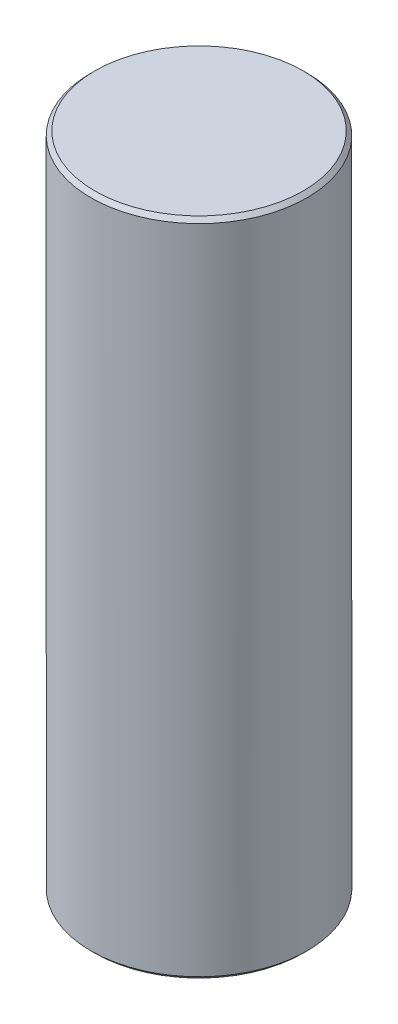
ISO-10303-21;
HEADER;
FILE_DESCRIPTION(('STEP AP214'),'2;1');
FILE_NAME('part.step','',(''),(''),'','','');
FILE_SCHEMA(('AUTOMOTIVE_DESIGN { 1 0 10303 214 1 1 1 1 }'));
ENDSEC;
DATA;
#1=APPLICATION_CONTEXT('core data for automotive mechanical design processes');
#2=APPLICATION_PROTOCOL_DEFINITION('international standard','automotive_design',2000,#1);
#3=PRODUCT_CONTEXT('',#1,'mechanical');
#4=PRODUCT('Part','Part','',(#3));
#5=PRODUCT_RELATED_PRODUCT_CATEGORY('part','',(#4));
#6=PRODUCT_DEFINITION_FORMATION('','',#4);
#7=PRODUCT_DEFINITION_CONTEXT('part definition',#1,'design');
#8=PRODUCT_DEFINITION('design','',#6,#7);
#9=PRODUCT_DEFINITION_SHAPE('','',#8);
#10=(LENGTH_UNIT() NAMED_UNIT(*) SI_UNIT(.MILLI.,.METRE.));
#11=(NAMED_UNIT(*) PLANE_ANGLE_UNIT() SI_UNIT($,.RADIAN.));
#12=(NAMED_UNIT(*) SI_UNIT($,.STERADIAN.) SOLID_ANGLE_UNIT());
#13=UNCERTAINTY_MEASURE_WITH_UNIT(LENGTH_MEASURE(1.E-05),#10,'distance_accuracy_value','');
#14=(GEOMETRIC_REPRESENTATION_CONTEXT(3) GLOBAL_UNCERTAINTY_ASSIGNED_CONTEXT((#13)) GLOBAL_UNIT_ASSIGNED_CONTEXT((#10,
#11,#12)) REPRESENTATION_CONTEXT('',''));
#15=CARTESIAN_POINT('',(0.,0.,0.));
#16=DIRECTION('',(0.,0.,1.));
#17=DIRECTION('',(1.,0.,0.));
#18=AXIS2_PLACEMENT_3D('',#15,#16,#17);
#19=CARTESIAN_POINT('',(0.,168.,0.));
#20=DIRECTION('',(0.,-1.,0.));
#21=DIRECTION('',(0.,0.,-1.));
#22=AXIS2_PLACEMENT_3D('',#19,#20,#21);
#23=CYLINDRICAL_SURFACE('',#22,27.5);
#24=CARTESIAN_POINT('',(0.,1.00000000000011,0.));
#25=DIRECTION('',(0.,1.,0.));
#26=DIRECTION('',(0.,0.,1.));
#27=AXIS2_PLACEMENT_3D('',#24,#25,#26);
#28=CIRCLE('',#27,27.5);
#29=CARTESIAN_POINT('',(0.,1.00000000000011,-27.5));
#30=VERTEX_POINT('',#29);
#31=EDGE_CURVE('E43',#30,#30,#28,.T.);
#32=CARTESIAN_POINT('',(0.,167.,0.));
#33=DIRECTION('',(0.,1.,0.));
#34=DIRECTION('',(0.,0.,1.));
#35=AXIS2_PLACEMENT_3D('',#32,#33,#34);
#36=CIRCLE('',#35,27.5);
#37=CARTESIAN_POINT('',(0.,167.,-27.5));
#38=VERTEX_POINT('',#37);
#39=EDGE_CURVE('E47',#38,#38,#36,.F.);
#40=CARTESIAN_POINT('',(0.,1.00000000000011,-27.5));
#41=CARTESIAN_POINT('',(0.,2.72916666666678,-27.5));
#42=CARTESIAN_POINT('',(0.,4.45833333333345,-27.5));
#43=CARTESIAN_POINT('',(0.,7.91666666666679,-27.5));
#44=CARTESIAN_POINT('',(0.,9.64583333333345,-27.5));
#45=CARTESIAN_POINT('',(0.,13.1041666666668,-27.5));
#46=CARTESIAN_POINT('',(0.,14.8333333333334,-27.5));
#47=CARTESIAN_POINT('',(0.,18.2916666666668,-27.5));
#48=CARTESIAN_POINT('',(0.,20.0208333333334,-27.5));
#49=CARTESIAN_POINT('',(0.,23.4791666666668,-27.5));
#50=CARTESIAN_POINT('',(0.,25.2083333333334,-27.5));
#51=CARTESIAN_POINT('',(0.,28.6666666666668,-27.5));
#52=CARTESIAN_POINT('',(0.,30.3958333333335,-27.5));
#53=CARTESIAN_POINT('',(0.,33.8541666666668,-27.5));
#54=CARTESIAN_POINT('',(0.,35.5833333333335,-27.5));
#55=CARTESIAN_POINT('',(0.,39.0416666666668,-27.5));
#56=CARTESIAN_POINT('',(0.,40.7708333333335,-27.5));
#57=CARTESIAN_POINT('',(0.,44.2291666666668,-27.5));
#58=CARTESIAN_POINT('',(0.,45.9583333333334,-27.5));
#59=CARTESIAN_POINT('',(0.,49.4166666666668,-27.5));
#60=CARTESIAN_POINT('',(0.,51.1458333333334,-27.5));
#61=CARTESIAN_POINT('',(0.,54.6041666666668,-27.5));
#62=CARTESIAN_POINT('',(0.,56.3333333333334,-27.5));
#63=CARTESIAN_POINT('',(0.,59.7916666666668,-27.5));
#64=CARTESIAN_POINT('',(0.,61.5208333333334,-27.5));
#65=CARTESIAN_POINT('',(0.,64.9791666666668,-27.5));
#66=CARTESIAN_POINT('',(0.,66.7083333333334,-27.5));
#67=CARTESIAN_POINT('',(0.,70.1666666666668,-27.5));
#68=CARTESIAN_POINT('',(0.,71.8958333333335,-27.5));
#69=CARTESIAN_POINT('',(0.,75.3541666666668,-27.5));
#70=CARTESIAN_POINT('',(0.,77.0833333333334,-27.5));
#71=CARTESIAN_POINT('',(0.,80.5416666666668,-27.5));
#72=CARTESIAN_POINT('',(0.,82.2708333333334,-27.5));
#73=CARTESIAN_POINT('',(0.,85.7291666666668,-27.5));
#74=CARTESIAN_POINT('',(0.,87.4583333333334,-27.5));
#75=CARTESIAN_POINT('',(0.,90.9166666666668,-27.5));
#76=CARTESIAN_POINT('',(0.,92.6458333333334,-27.5));
#77=CARTESIAN_POINT('',(0.,96.1041666666668,-27.5));
#78=CARTESIAN_POINT('',(0.,97.8333333333335,-27.5));
#79=CARTESIAN_POINT('',(0.,101.291666666667,-27.5));
#80=CARTESIAN_POINT('',(0.,103.020833333333,-27.5));
#81=CARTESIAN_POINT('',(0.,106.479166666667,-27.5));
#82=CARTESIAN_POINT('',(0.,108.208333333333,-27.5));
#83=CARTESIAN_POINT('',(0.,111.666666666667,-27.5));
#84=CARTESIAN_POINT('',(0.,113.395833333333,-27.5));
#85=CARTESIAN_POINT('',(0.,116.854166666667,-27.5));
#86=CARTESIAN_POINT('',(0.,118.583333333333,-27.5));
#87=CARTESIAN_POINT('',(0.,122.041666666667,-27.5));
#88=CARTESIAN_POINT('',(0.,123.770833333333,-27.5));
#89=CARTESIAN_POINT('',(0.,127.229166666667,-27.5));
#90=CARTESIAN_POINT('',(0.,128.958333333333,-27.5));
#91=CARTESIAN_POINT('',(0.,132.416666666667,-27.5));
#92=CARTESIAN_POINT('',(0.,134.145833333333,-27.5));
#93=CARTESIAN_POINT('',(0.,137.604166666667,-27.5));
#94=CARTESIAN_POINT('',(0.,139.333333333333,-27.5));
#95=CARTESIAN_POINT('',(0.,142.791666666667,-27.5));
#96=CARTESIAN_POINT('',(0.,144.520833333333,-27.5));
#97=CARTESIAN_POINT('',(0.,147.979166666667,-27.5));
#98=CARTESIAN_POINT('',(0.,149.708333333333,-27.5));
#99=CARTESIAN_POINT('',(0.,153.166666666667,-27.5));
#100=CARTESIAN_POINT('',(0.,154.895833333333,-27.5));
#101=CARTESIAN_POINT('',(0.,158.354166666667,-27.5));
#102=CARTESIAN_POINT('',(0.,160.083333333333,-27.5));
#103=CARTESIAN_POINT('',(0.,163.541666666667,-27.5));
#104=CARTESIAN_POINT('',(0.,165.270833333333,-27.5));
#105=CARTESIAN_POINT('',(0.,167.,-27.5));
#106=B_SPLINE_CURVE_WITH_KNOTS('',3,(#40,#41,#42,#43,#44,#45,#46,#47,#48,#49,#50,#51,#52,#53,
#54,#55,#56,#57,#58,#59,#60,#61,#62,#63,#64,#65,#66,#67,#68,#69,#70,#71,#72,#73,#74,#75,#76,#77,
#78,#79,#80,#81,#82,#83,#84,#85,#86,#87,#88,#89,#90,#91,#92,#93,#94,#95,#96,#97,#98,#99,#100,
#101,#102,#103,#104,#105),.UNSPECIFIED.,.F.,.F.,(4,2,2,2,2,2,2,2,2,2,2,2,2,2,2,2,2,2,2,2,2,2,2,
2,2,2,2,2,2,2,2,2,4),(0.,5.18750000000001,10.375,15.5625,20.75,25.9375,31.125,36.3125,41.5,
46.6875,51.875,57.0625,62.25,67.4375,72.625,77.8125,83.,88.1875,93.375,98.5625,103.75,108.9375,
114.125,119.3125,124.5,129.6875,134.875,140.0625,145.25,150.4375,155.625,160.8125,166.),.UNSPECIFIED.);
#107=EDGE_CURVE('BSEAM32',#30,#38,#106,.T.);
#108=ORIENTED_EDGE('',*,*,#31,.T.);
#109=ORIENTED_EDGE('',*,*,#39,.T.);
#110=ORIENTED_EDGE('',*,*,#107,.T.);
#111=ORIENTED_EDGE('',*,*,#107,.F.);
#112=EDGE_LOOP('',(#108,#110,#109,#111));
#113=FACE_BOUND('',#112,.T.);
#114=ADVANCED_FACE('F32',(#113),#23,.T.);
#115=CARTESIAN_POINT('',(0.,168.,0.));
#116=DIRECTION('',(0.,1.,0.));
#117=DIRECTION('',(0.,0.,1.));
#118=AXIS2_PLACEMENT_3D('',#115,#116,#117);
#119=PLANE('',#118);
#120=CARTESIAN_POINT('',(0.,168.,0.));
#121=DIRECTION('',(0.,1.,0.));
#122=DIRECTION('',(0.,0.,1.));
#123=AXIS2_PLACEMENT_3D('',#120,#121,#122);
#124=CIRCLE('',#123,26.5000000000002);
#125=CARTESIAN_POINT('',(0.,168.,26.5000000000002));
#126=VERTEX_POINT('',#125);
#127=EDGE_CURVE('E10',#126,#126,#124,.T.);
#128=ORIENTED_EDGE('',*,*,#127,.T.);
#129=EDGE_LOOP('',(#128));
#130=FACE_BOUND('',#129,.T.);
#131=ADVANCED_FACE('F63',(#130),#119,.T.);
#132=CARTESIAN_POINT('',(0.,0.,0.));
#133=DIRECTION('',(0.,1.,0.));
#134=DIRECTION('',(0.,0.,1.));
#135=AXIS2_PLACEMENT_3D('',#132,#133,#134);
#136=PLANE('',#135);
#137=CARTESIAN_POINT('',(0.,0.,0.));
#138=DIRECTION('',(0.,1.,0.));
#139=DIRECTION('',(0.,0.,1.));
#140=AXIS2_PLACEMENT_3D('',#137,#138,#139);
#141=CIRCLE('',#140,26.4999999999999);
#142=CARTESIAN_POINT('',(0.,0.,26.4999999999999));
#143=VERTEX_POINT('',#142);
#144=EDGE_CURVE('E39',#143,#143,#141,.F.);
#145=ORIENTED_EDGE('',*,*,#144,.T.);
#146=EDGE_LOOP('',(#145));
#147=FACE_BOUND('',#146,.T.);
#148=ADVANCED_FACE('F60',(#147),#136,.F.);
#149=CARTESIAN_POINT('',(0.,1.00000000000011,0.));
#150=DIRECTION('',(0.,1.,0.));
#151=DIRECTION('',(0.,0.,1.));
#152=AXIS2_PLACEMENT_3D('',#149,#150,#151);
#153=CONICAL_SURFACE('',#152,27.5,0.785398163397454);
#154=ORIENTED_EDGE('',*,*,#144,.F.);
#155=EDGE_LOOP('',(#154));
#156=FACE_BOUND('',#155,.T.);
#157=ORIENTED_EDGE('',*,*,#31,.F.);
#158=EDGE_LOOP('',(#157));
#159=FACE_BOUND('',#158,.T.);
#160=ADVANCED_FACE('F56',(#156,#159),#153,.T.);
#161=CARTESIAN_POINT('',(0.,168.,0.));
#162=DIRECTION('',(0.,-1.,0.));
#163=DIRECTION('',(0.,0.,-1.));
#164=AXIS2_PLACEMENT_3D('',#161,#162,#163);
#165=CONICAL_SURFACE('',#164,26.5000000000002,0.785398163397438);
#166=ORIENTED_EDGE('',*,*,#39,.F.);
#167=EDGE_LOOP('',(#166));
#168=FACE_BOUND('',#167,.T.);
#169=ORIENTED_EDGE('',*,*,#127,.F.);
#170=EDGE_LOOP('',(#169));
#171=FACE_BOUND('',#170,.T.);
#172=ADVANCED_FACE('F34',(#168,#171),#165,.T.);
#173=CLOSED_SHELL('',(#114,#131,#148,#160,#172));
#174=MANIFOLD_SOLID_BREP('B2',#173);
#175=ADVANCED_BREP_SHAPE_REPRESENTATION('',(#18,#174),#14);
#176=SHAPE_DEFINITION_REPRESENTATION(#9,#175);
ENDSEC;
END-ISO-10303-21;
